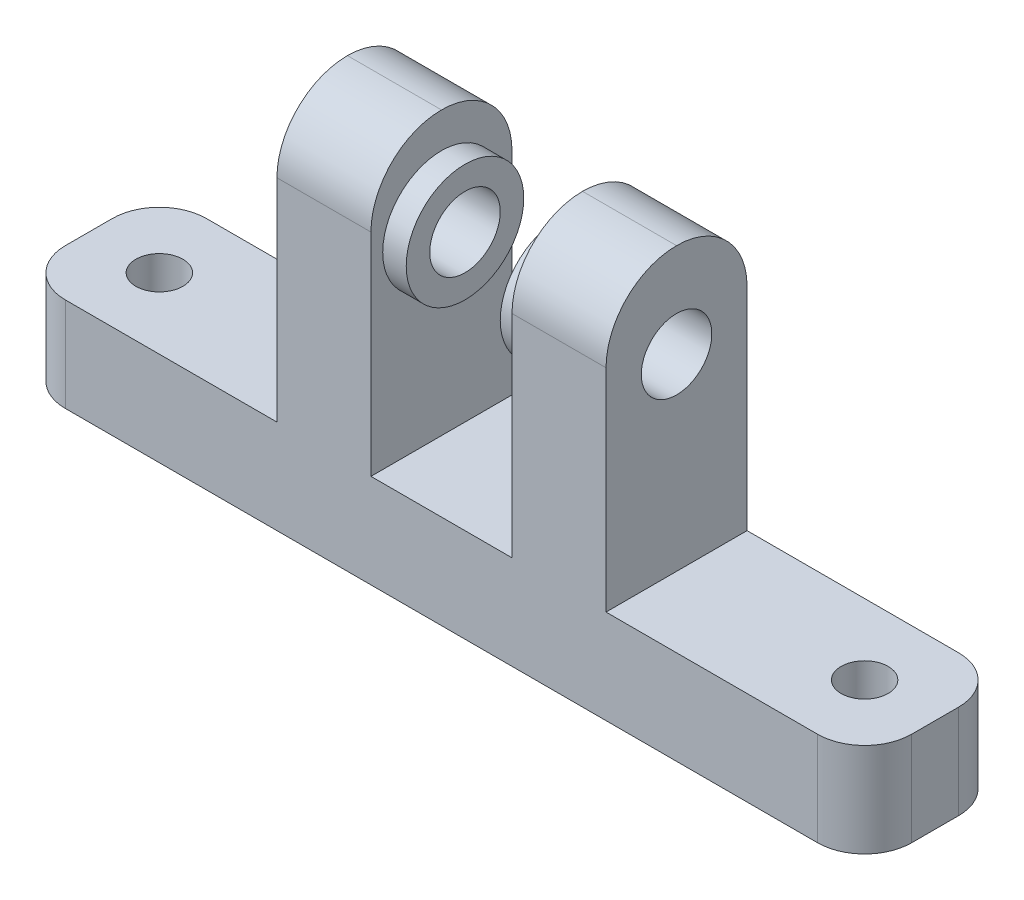
ISO-10303-21;
HEADER;
FILE_DESCRIPTION(('STEP AP214'),'2;1');
FILE_NAME('part.step','',(''),(''),'','','');
FILE_SCHEMA(('AUTOMOTIVE_DESIGN { 1 0 10303 214 1 1 1 1 }'));
ENDSEC;
DATA;
#1=APPLICATION_CONTEXT('core data for automotive mechanical design processes');
#2=APPLICATION_PROTOCOL_DEFINITION('international standard','automotive_design',2000,#1);
#3=PRODUCT_CONTEXT('',#1,'mechanical');
#4=PRODUCT('Part','Part','',(#3));
#5=PRODUCT_RELATED_PRODUCT_CATEGORY('part','',(#4));
#6=PRODUCT_DEFINITION_FORMATION('','',#4);
#7=PRODUCT_DEFINITION_CONTEXT('part definition',#1,'design');
#8=PRODUCT_DEFINITION('design','',#6,#7);
#9=PRODUCT_DEFINITION_SHAPE('','',#8);
#10=(LENGTH_UNIT() NAMED_UNIT(*) SI_UNIT(.MILLI.,.METRE.));
#11=(NAMED_UNIT(*) PLANE_ANGLE_UNIT() SI_UNIT($,.RADIAN.));
#12=(NAMED_UNIT(*) SI_UNIT($,.STERADIAN.) SOLID_ANGLE_UNIT());
#13=UNCERTAINTY_MEASURE_WITH_UNIT(LENGTH_MEASURE(1.E-05),#10,'distance_accuracy_value','');
#14=(GEOMETRIC_REPRESENTATION_CONTEXT(3) GLOBAL_UNCERTAINTY_ASSIGNED_CONTEXT((#13)) GLOBAL_UNIT_ASSIGNED_CONTEXT((#10,
#11,#12)) REPRESENTATION_CONTEXT('',''));
#15=CARTESIAN_POINT('',(0.,0.,0.));
#16=DIRECTION('',(0.,0.,1.));
#17=DIRECTION('',(1.,0.,0.));
#18=AXIS2_PLACEMENT_3D('',#15,#16,#17);
#19=CARTESIAN_POINT('',(-7.,4.,-3.));
#20=DIRECTION('',(1.,0.,0.));
#21=DIRECTION('',(0.,0.,-1.));
#22=AXIS2_PLACEMENT_3D('',#19,#20,#21);
#23=PLANE('',#22);
#24=CARTESIAN_POINT('',(-7.,12.,0.));
#25=DIRECTION('',(1.,0.,0.));
#26=DIRECTION('',(0.,0.,-1.));
#27=AXIS2_PLACEMENT_3D('',#24,#25,#26);
#28=CIRCLE('',#27,1.5);
#29=CARTESIAN_POINT('',(-7.,12.,-1.5));
#30=VERTEX_POINT('',#29);
#31=EDGE_CURVE('E234',#30,#30,#28,.T.);
#32=ORIENTED_EDGE('',*,*,#31,.T.);
#33=EDGE_LOOP('',(#32));
#34=FACE_BOUND('',#33,.T.);
#35=CARTESIAN_POINT('',(-7.,13.,0.));
#36=DIRECTION('',(1.,0.,0.));
#37=DIRECTION('',(0.,0.,-1.));
#38=AXIS2_PLACEMENT_3D('',#35,#36,#37);
#39=CIRCLE('',#38,3.);
#40=CARTESIAN_POINT('',(-7.,13.,3.));
#41=VERTEX_POINT('',#40);
#42=CARTESIAN_POINT('',(-7.,16.,0.));
#43=VERTEX_POINT('',#42);
#44=EDGE_CURVE('E309',#41,#43,#39,.F.);
#45=ORIENTED_EDGE('',*,*,#44,.T.);
#46=CARTESIAN_POINT('',(-7.,13.,0.));
#47=DIRECTION('',(1.,0.,0.));
#48=DIRECTION('',(0.,0.,-1.));
#49=AXIS2_PLACEMENT_3D('',#46,#47,#48);
#50=CIRCLE('',#49,3.);
#51=CARTESIAN_POINT('',(-7.,13.,-3.));
#52=VERTEX_POINT('',#51);
#53=EDGE_CURVE('E166',#43,#52,#50,.F.);
#54=ORIENTED_EDGE('',*,*,#53,.T.);
#55=DIRECTION('',(0.,-1.,0.));
#56=VECTOR('',#55,1.);
#57=CARTESIAN_POINT('',(-7.,4.,-3.));
#58=LINE('',#57,#56);
#59=CARTESIAN_POINT('',(-7.,4.,-3.));
#60=VERTEX_POINT('',#59);
#61=EDGE_CURVE('E160',#52,#60,#58,.T.);
#62=ORIENTED_EDGE('',*,*,#61,.T.);
#63=DIRECTION('',(0.,0.,-1.));
#64=VECTOR('',#63,1.);
#65=CARTESIAN_POINT('',(-7.,4.,3.));
#66=LINE('',#65,#64);
#67=CARTESIAN_POINT('',(-7.,4.,3.));
#68=VERTEX_POINT('',#67);
#69=EDGE_CURVE('E164',#68,#60,#66,.T.);
#70=ORIENTED_EDGE('',*,*,#69,.F.);
#71=DIRECTION('',(0.,-1.,0.));
#72=VECTOR('',#71,1.);
#73=CARTESIAN_POINT('',(-7.,4.,3.));
#74=LINE('',#73,#72);
#75=EDGE_CURVE('E171',#41,#68,#74,.T.);
#76=ORIENTED_EDGE('',*,*,#75,.F.);
#77=EDGE_LOOP('',(#45,#54,#62,#70,#76));
#78=FACE_BOUND('',#77,.T.);
#79=ADVANCED_FACE('F36',(#34,#78),#23,.F.);
#80=CARTESIAN_POINT('',(7.,4.,-3.));
#81=DIRECTION('',(-1.,0.,0.));
#82=DIRECTION('',(0.,0.,1.));
#83=AXIS2_PLACEMENT_3D('',#80,#81,#82);
#84=PLANE('',#83);
#85=CARTESIAN_POINT('',(7.,12.,0.));
#86=DIRECTION('',(-1.,0.,0.));
#87=DIRECTION('',(0.,0.,1.));
#88=AXIS2_PLACEMENT_3D('',#85,#86,#87);
#89=CIRCLE('',#88,1.5);
#90=CARTESIAN_POINT('',(7.,12.,1.5));
#91=VERTEX_POINT('',#90);
#92=EDGE_CURVE('E237',#91,#91,#89,.T.);
#93=ORIENTED_EDGE('',*,*,#92,.T.);
#94=EDGE_LOOP('',(#93));
#95=FACE_BOUND('',#94,.T.);
#96=DIRECTION('',(0.,-1.,0.));
#97=VECTOR('',#96,1.);
#98=CARTESIAN_POINT('',(7.,4.,-3.));
#99=LINE('',#98,#97);
#100=CARTESIAN_POINT('',(7.,13.,-3.));
#101=VERTEX_POINT('',#100);
#102=CARTESIAN_POINT('',(7.,4.,-3.));
#103=VERTEX_POINT('',#102);
#104=EDGE_CURVE('E170',#101,#103,#99,.T.);
#105=ORIENTED_EDGE('',*,*,#104,.F.);
#106=CARTESIAN_POINT('',(7.,13.,0.));
#107=DIRECTION('',(-1.,0.,0.));
#108=DIRECTION('',(0.,0.,1.));
#109=AXIS2_PLACEMENT_3D('',#106,#107,#108);
#110=CIRCLE('',#109,3.);
#111=CARTESIAN_POINT('',(7.,16.,0.));
#112=VERTEX_POINT('',#111);
#113=EDGE_CURVE('E58',#101,#112,#110,.F.);
#114=ORIENTED_EDGE('',*,*,#113,.T.);
#115=CARTESIAN_POINT('',(7.,13.,0.));
#116=DIRECTION('',(-1.,0.,0.));
#117=DIRECTION('',(0.,0.,1.));
#118=AXIS2_PLACEMENT_3D('',#115,#116,#117);
#119=CIRCLE('',#118,3.);
#120=CARTESIAN_POINT('',(7.,13.,3.));
#121=VERTEX_POINT('',#120);
#122=EDGE_CURVE('E53',#112,#121,#119,.F.);
#123=ORIENTED_EDGE('',*,*,#122,.T.);
#124=DIRECTION('',(0.,-1.,0.));
#125=VECTOR('',#124,1.);
#126=CARTESIAN_POINT('',(7.,4.,3.));
#127=LINE('',#126,#125);
#128=CARTESIAN_POINT('',(7.,4.,3.));
#129=VERTEX_POINT('',#128);
#130=EDGE_CURVE('E262',#121,#129,#127,.T.);
#131=ORIENTED_EDGE('',*,*,#130,.T.);
#132=DIRECTION('',(0.,0.,1.));
#133=VECTOR('',#132,1.);
#134=CARTESIAN_POINT('',(7.,4.,-3.));
#135=LINE('',#134,#133);
#136=EDGE_CURVE('E205',#103,#129,#135,.T.);
#137=ORIENTED_EDGE('',*,*,#136,.F.);
#138=EDGE_LOOP('',(#105,#114,#123,#131,#137));
#139=FACE_BOUND('',#138,.T.);
#140=ADVANCED_FACE('F400',(#95,#139),#84,.F.);
#141=CARTESIAN_POINT('',(3.,16.,3.));
#142=DIRECTION('',(1.,0.,0.));
#143=DIRECTION('',(0.,0.,-1.));
#144=AXIS2_PLACEMENT_3D('',#141,#142,#143);
#145=PLANE('',#144);
#146=CARTESIAN_POINT('',(3.,13.,0.));
#147=DIRECTION('',(1.,0.,0.));
#148=DIRECTION('',(0.,0.,-1.));
#149=AXIS2_PLACEMENT_3D('',#146,#147,#148);
#150=CIRCLE('',#149,3.);
#151=CARTESIAN_POINT('',(3.,13.,3.));
#152=VERTEX_POINT('',#151);
#153=CARTESIAN_POINT('',(3.,16.,0.));
#154=VERTEX_POINT('',#153);
#155=EDGE_CURVE('E321',#152,#154,#150,.F.);
#156=ORIENTED_EDGE('',*,*,#155,.T.);
#157=CARTESIAN_POINT('',(3.,13.,0.));
#158=DIRECTION('',(1.,0.,0.));
#159=DIRECTION('',(0.,0.,-1.));
#160=AXIS2_PLACEMENT_3D('',#157,#158,#159);
#161=CIRCLE('',#160,3.);
#162=CARTESIAN_POINT('',(3.,13.,-3.));
#163=VERTEX_POINT('',#162);
#164=EDGE_CURVE('E323',#154,#163,#161,.F.);
#165=ORIENTED_EDGE('',*,*,#164,.T.);
#166=DIRECTION('',(0.,-1.,0.));
#167=VECTOR('',#166,1.);
#168=CARTESIAN_POINT('',(3.,16.,-3.));
#169=LINE('',#168,#167);
#170=CARTESIAN_POINT('',(3.,4.,-3.));
#171=VERTEX_POINT('',#170);
#172=EDGE_CURVE('E240',#163,#171,#169,.T.);
#173=ORIENTED_EDGE('',*,*,#172,.T.);
#174=DIRECTION('',(0.,0.,1.));
#175=VECTOR('',#174,1.);
#176=CARTESIAN_POINT('',(3.,4.,3.));
#177=LINE('',#176,#175);
#178=CARTESIAN_POINT('',(3.,4.,3.));
#179=VERTEX_POINT('',#178);
#180=EDGE_CURVE('E244',#171,#179,#177,.T.);
#181=ORIENTED_EDGE('',*,*,#180,.T.);
#182=DIRECTION('',(0.,-1.,0.));
#183=VECTOR('',#182,1.);
#184=CARTESIAN_POINT('',(3.,16.,3.));
#185=LINE('',#184,#183);
#186=EDGE_CURVE('E242',#152,#179,#185,.T.);
#187=ORIENTED_EDGE('',*,*,#186,.F.);
#188=EDGE_LOOP('',(#156,#165,#173,#181,#187));
#189=FACE_BOUND('',#188,.T.);
#190=CARTESIAN_POINT('',(3.,12.,0.));
#191=DIRECTION('',(1.,0.,0.));
#192=DIRECTION('',(0.,0.,-1.));
#193=AXIS2_PLACEMENT_3D('',#190,#191,#192);
#194=CIRCLE('',#193,2.5);
#195=CARTESIAN_POINT('',(3.,12.,-2.5));
#196=VERTEX_POINT('',#195);
#197=EDGE_CURVE('E272',#196,#196,#194,.F.);
#198=ORIENTED_EDGE('',*,*,#197,.F.);
#199=EDGE_LOOP('',(#198));
#200=FACE_BOUND('',#199,.T.);
#201=ADVANCED_FACE('F345',(#189,#200),#145,.F.);
#202=CARTESIAN_POINT('',(-3.,16.,3.));
#203=DIRECTION('',(-1.,0.,0.));
#204=DIRECTION('',(0.,0.,1.));
#205=AXIS2_PLACEMENT_3D('',#202,#203,#204);
#206=PLANE('',#205);
#207=DIRECTION('',(0.,-1.,0.));
#208=VECTOR('',#207,1.);
#209=CARTESIAN_POINT('',(-3.,16.,-3.));
#210=LINE('',#209,#208);
#211=CARTESIAN_POINT('',(-3.,13.,-3.));
#212=VERTEX_POINT('',#211);
#213=CARTESIAN_POINT('',(-3.,4.,-3.));
#214=VERTEX_POINT('',#213);
#215=EDGE_CURVE('E250',#212,#214,#210,.T.);
#216=ORIENTED_EDGE('',*,*,#215,.F.);
#217=CARTESIAN_POINT('',(-3.,13.,0.));
#218=DIRECTION('',(-1.,0.,0.));
#219=DIRECTION('',(0.,0.,1.));
#220=AXIS2_PLACEMENT_3D('',#217,#218,#219);
#221=CIRCLE('',#220,3.);
#222=CARTESIAN_POINT('',(-3.,16.,0.));
#223=VERTEX_POINT('',#222);
#224=EDGE_CURVE('E319',#212,#223,#221,.F.);
#225=ORIENTED_EDGE('',*,*,#224,.T.);
#226=CARTESIAN_POINT('',(-3.,13.,0.));
#227=DIRECTION('',(-1.,0.,0.));
#228=DIRECTION('',(0.,0.,1.));
#229=AXIS2_PLACEMENT_3D('',#226,#227,#228);
#230=CIRCLE('',#229,3.);
#231=CARTESIAN_POINT('',(-3.,13.,3.));
#232=VERTEX_POINT('',#231);
#233=EDGE_CURVE('E317',#223,#232,#230,.F.);
#234=ORIENTED_EDGE('',*,*,#233,.T.);
#235=DIRECTION('',(0.,-1.,0.));
#236=VECTOR('',#235,1.);
#237=CARTESIAN_POINT('',(-3.,16.,3.));
#238=LINE('',#237,#236);
#239=CARTESIAN_POINT('',(-3.,4.,3.));
#240=VERTEX_POINT('',#239);
#241=EDGE_CURVE('E252',#232,#240,#238,.T.);
#242=ORIENTED_EDGE('',*,*,#241,.T.);
#243=DIRECTION('',(0.,0.,-1.));
#244=VECTOR('',#243,1.);
#245=CARTESIAN_POINT('',(-3.,4.,3.));
#246=LINE('',#245,#244);
#247=EDGE_CURVE('E247',#240,#214,#246,.T.);
#248=ORIENTED_EDGE('',*,*,#247,.T.);
#249=EDGE_LOOP('',(#216,#225,#234,#242,#248));
#250=FACE_BOUND('',#249,.T.);
#251=CARTESIAN_POINT('',(-3.,12.,0.));
#252=DIRECTION('',(-1.,0.,0.));
#253=DIRECTION('',(0.,0.,1.));
#254=AXIS2_PLACEMENT_3D('',#251,#252,#253);
#255=CIRCLE('',#254,2.5);
#256=CARTESIAN_POINT('',(-3.,12.,2.5));
#257=VERTEX_POINT('',#256);
#258=EDGE_CURVE('E269',#257,#257,#255,.F.);
#259=ORIENTED_EDGE('',*,*,#258,.F.);
#260=EDGE_LOOP('',(#259));
#261=FACE_BOUND('',#260,.T.);
#262=ADVANCED_FACE('F355',(#250,#261),#206,.F.);
#263=CARTESIAN_POINT('',(0.,4.,0.));
#264=DIRECTION('',(0.,1.,0.));
#265=DIRECTION('',(0.,0.,1.));
#266=AXIS2_PLACEMENT_3D('',#263,#264,#265);
#267=PLANE('',#266);
#268=DIRECTION('',(1.,0.,0.));
#269=VECTOR('',#268,1.);
#270=CARTESIAN_POINT('',(-7.,4.,3.));
#271=LINE('',#270,#269);
#272=EDGE_CURVE('E258',#240,#179,#271,.T.);
#273=ORIENTED_EDGE('',*,*,#272,.T.);
#274=ORIENTED_EDGE('',*,*,#180,.F.);
#275=DIRECTION('',(-1.,0.,0.));
#276=VECTOR('',#275,1.);
#277=CARTESIAN_POINT('',(-7.,4.,-3.));
#278=LINE('',#277,#276);
#279=EDGE_CURVE('E255',#171,#214,#278,.T.);
#280=ORIENTED_EDGE('',*,*,#279,.T.);
#281=ORIENTED_EDGE('',*,*,#247,.F.);
#282=EDGE_LOOP('',(#273,#274,#280,#281));
#283=FACE_BOUND('',#282,.T.);
#284=ADVANCED_FACE('F351',(#283),#267,.T.);
#285=CARTESIAN_POINT('',(-7.,4.,-3.));
#286=DIRECTION('',(0.,0.,1.));
#287=DIRECTION('',(1.,0.,0.));
#288=AXIS2_PLACEMENT_3D('',#285,#286,#287);
#289=PLANE('',#288);
#290=ORIENTED_EDGE('',*,*,#61,.F.);
#291=DIRECTION('',(-1.,0.,0.));
#292=VECTOR('',#291,1.);
#293=CARTESIAN_POINT('',(-3.,13.,-3.));
#294=LINE('',#293,#292);
#295=EDGE_CURVE('E315',#52,#212,#294,.F.);
#296=ORIENTED_EDGE('',*,*,#295,.T.);
#297=ORIENTED_EDGE('',*,*,#215,.T.);
#298=ORIENTED_EDGE('',*,*,#279,.F.);
#299=ORIENTED_EDGE('',*,*,#172,.F.);
#300=DIRECTION('',(-1.,0.,0.));
#301=VECTOR('',#300,1.);
#302=CARTESIAN_POINT('',(-7.,13.,-3.));
#303=LINE('',#302,#301);
#304=EDGE_CURVE('E312',#163,#101,#303,.F.);
#305=ORIENTED_EDGE('',*,*,#304,.T.);
#306=ORIENTED_EDGE('',*,*,#104,.T.);
#307=DIRECTION('',(-1.,0.,0.));
#308=VECTOR('',#307,1.);
#309=CARTESIAN_POINT('',(18.,4.,-3.));
#310=LINE('',#309,#308);
#311=CARTESIAN_POINT('',(16.,4.,-3.));
#312=VERTEX_POINT('',#311);
#313=EDGE_CURVE('E212',#312,#103,#310,.T.);
#314=ORIENTED_EDGE('',*,*,#313,.F.);
#315=DIRECTION('',(0.,1.,0.));
#316=VECTOR('',#315,1.);
#317=CARTESIAN_POINT('',(16.,0.,-3.));
#318=LINE('',#317,#316);
#319=CARTESIAN_POINT('',(16.,0.,-3.));
#320=VERTEX_POINT('',#319);
#321=EDGE_CURVE('E285',#312,#320,#318,.F.);
#322=ORIENTED_EDGE('',*,*,#321,.T.);
#323=DIRECTION('',(-1.,0.,0.));
#324=VECTOR('',#323,1.);
#325=CARTESIAN_POINT('',(-7.,0.,-3.));
#326=LINE('',#325,#324);
#327=CARTESIAN_POINT('',(-16.,0.,-3.));
#328=VERTEX_POINT('',#327);
#329=EDGE_CURVE('E254',#320,#328,#326,.T.);
#330=ORIENTED_EDGE('',*,*,#329,.T.);
#331=DIRECTION('',(0.,1.,0.));
#332=VECTOR('',#331,1.);
#333=CARTESIAN_POINT('',(-16.,4.,-3.));
#334=LINE('',#333,#332);
#335=CARTESIAN_POINT('',(-16.,4.,-3.));
#336=VERTEX_POINT('',#335);
#337=EDGE_CURVE('E179',#328,#336,#334,.T.);
#338=ORIENTED_EDGE('',*,*,#337,.T.);
#339=DIRECTION('',(-1.,0.,0.));
#340=VECTOR('',#339,1.);
#341=CARTESIAN_POINT('',(-7.,4.,-3.));
#342=LINE('',#341,#340);
#343=EDGE_CURVE('E175',#60,#336,#342,.T.);
#344=ORIENTED_EDGE('',*,*,#343,.F.);
#345=EDGE_LOOP('',(#290,#296,#297,#298,#299,#305,#306,#314,#322,#330,#338,#344));
#346=FACE_BOUND('',#345,.T.);
#347=ADVANCED_FACE('F176',(#346),#289,.F.);
#348=CARTESIAN_POINT('',(-7.,4.,3.));
#349=DIRECTION('',(0.,0.,-1.));
#350=DIRECTION('',(-1.,0.,0.));
#351=AXIS2_PLACEMENT_3D('',#348,#349,#350);
#352=PLANE('',#351);
#353=ORIENTED_EDGE('',*,*,#130,.F.);
#354=DIRECTION('',(1.,0.,0.));
#355=VECTOR('',#354,1.);
#356=CARTESIAN_POINT('',(-7.,13.,3.));
#357=LINE('',#356,#355);
#358=EDGE_CURVE('E11',#121,#152,#357,.F.);
#359=ORIENTED_EDGE('',*,*,#358,.T.);
#360=ORIENTED_EDGE('',*,*,#186,.T.);
#361=ORIENTED_EDGE('',*,*,#272,.F.);
#362=ORIENTED_EDGE('',*,*,#241,.F.);
#363=DIRECTION('',(1.,0.,0.));
#364=VECTOR('',#363,1.);
#365=CARTESIAN_POINT('',(-7.,13.,3.));
#366=LINE('',#365,#364);
#367=EDGE_CURVE('E45',#232,#41,#366,.F.);
#368=ORIENTED_EDGE('',*,*,#367,.T.);
#369=ORIENTED_EDGE('',*,*,#75,.T.);
#370=DIRECTION('',(1.,0.,0.));
#371=VECTOR('',#370,1.);
#372=CARTESIAN_POINT('',(-18.,4.,3.));
#373=LINE('',#372,#371);
#374=CARTESIAN_POINT('',(-16.,4.,3.));
#375=VERTEX_POINT('',#374);
#376=EDGE_CURVE('E186',#375,#68,#373,.T.);
#377=ORIENTED_EDGE('',*,*,#376,.F.);
#378=DIRECTION('',(0.,1.,0.));
#379=VECTOR('',#378,1.);
#380=CARTESIAN_POINT('',(-16.,0.,3.));
#381=LINE('',#380,#379);
#382=CARTESIAN_POINT('',(-16.,0.,3.));
#383=VERTEX_POINT('',#382);
#384=EDGE_CURVE('E307',#375,#383,#381,.F.);
#385=ORIENTED_EDGE('',*,*,#384,.T.);
#386=DIRECTION('',(1.,0.,0.));
#387=VECTOR('',#386,1.);
#388=CARTESIAN_POINT('',(-7.,0.,3.));
#389=LINE('',#388,#387);
#390=CARTESIAN_POINT('',(16.,0.,3.));
#391=VERTEX_POINT('',#390);
#392=EDGE_CURVE('E259',#383,#391,#389,.T.);
#393=ORIENTED_EDGE('',*,*,#392,.T.);
#394=DIRECTION('',(0.,1.,0.));
#395=VECTOR('',#394,1.);
#396=CARTESIAN_POINT('',(16.,4.,3.));
#397=LINE('',#396,#395);
#398=CARTESIAN_POINT('',(16.,4.,3.));
#399=VERTEX_POINT('',#398);
#400=EDGE_CURVE('E304',#391,#399,#397,.T.);
#401=ORIENTED_EDGE('',*,*,#400,.T.);
#402=DIRECTION('',(1.,0.,0.));
#403=VECTOR('',#402,1.);
#404=CARTESIAN_POINT('',(18.,4.,3.));
#405=LINE('',#404,#403);
#406=EDGE_CURVE('E215',#129,#399,#405,.T.);
#407=ORIENTED_EDGE('',*,*,#406,.F.);
#408=EDGE_LOOP('',(#353,#359,#360,#361,#362,#368,#369,#377,#385,#393,#401,#407));
#409=FACE_BOUND('',#408,.T.);
#410=ADVANCED_FACE('F341',(#409),#352,.F.);
#411=CARTESIAN_POINT('',(0.,0.,0.));
#412=DIRECTION('',(0.,1.,0.));
#413=DIRECTION('',(0.,0.,1.));
#414=AXIS2_PLACEMENT_3D('',#411,#412,#413);
#415=PLANE('',#414);
#416=ORIENTED_EDGE('',*,*,#329,.F.);
#417=CARTESIAN_POINT('',(16.,0.,-1.));
#418=DIRECTION('',(0.,1.,0.));
#419=DIRECTION('',(0.,0.,1.));
#420=AXIS2_PLACEMENT_3D('',#417,#418,#419);
#421=CIRCLE('',#420,2.);
#422=CARTESIAN_POINT('',(18.,0.,-1.));
#423=VERTEX_POINT('',#422);
#424=EDGE_CURVE('E293',#320,#423,#421,.F.);
#425=ORIENTED_EDGE('',*,*,#424,.T.);
#426=DIRECTION('',(0.,0.,-1.));
#427=VECTOR('',#426,1.);
#428=CARTESIAN_POINT('',(18.,0.,-3.));
#429=LINE('',#428,#427);
#430=CARTESIAN_POINT('',(18.,0.,1.));
#431=VERTEX_POINT('',#430);
#432=EDGE_CURVE('E208',#431,#423,#429,.T.);
#433=ORIENTED_EDGE('',*,*,#432,.F.);
#434=CARTESIAN_POINT('',(16.,0.,1.));
#435=DIRECTION('',(0.,1.,0.));
#436=DIRECTION('',(0.,0.,1.));
#437=AXIS2_PLACEMENT_3D('',#434,#435,#436);
#438=CIRCLE('',#437,2.);
#439=EDGE_CURVE('E287',#431,#391,#438,.F.);
#440=ORIENTED_EDGE('',*,*,#439,.T.);
#441=ORIENTED_EDGE('',*,*,#392,.F.);
#442=CARTESIAN_POINT('',(-16.,0.,1.));
#443=DIRECTION('',(0.,1.,0.));
#444=DIRECTION('',(0.,0.,1.));
#445=AXIS2_PLACEMENT_3D('',#442,#443,#444);
#446=CIRCLE('',#445,2.);
#447=CARTESIAN_POINT('',(-18.,0.,1.));
#448=VERTEX_POINT('',#447);
#449=EDGE_CURVE('E289',#383,#448,#446,.F.);
#450=ORIENTED_EDGE('',*,*,#449,.T.);
#451=DIRECTION('',(0.,0.,1.));
#452=VECTOR('',#451,1.);
#453=CARTESIAN_POINT('',(-18.,0.,-3.));
#454=LINE('',#453,#452);
#455=CARTESIAN_POINT('',(-18.,0.,-1.));
#456=VERTEX_POINT('',#455);
#457=EDGE_CURVE('E192',#456,#448,#454,.T.);
#458=ORIENTED_EDGE('',*,*,#457,.F.);
#459=CARTESIAN_POINT('',(-16.,0.,-1.));
#460=DIRECTION('',(0.,1.,0.));
#461=DIRECTION('',(0.,0.,1.));
#462=AXIS2_PLACEMENT_3D('',#459,#460,#461);
#463=CIRCLE('',#462,2.);
#464=EDGE_CURVE('E291',#456,#328,#463,.F.);
#465=ORIENTED_EDGE('',*,*,#464,.T.);
#466=EDGE_LOOP('',(#416,#425,#433,#440,#441,#450,#458,#465));
#467=FACE_BOUND('',#466,.T.);
#468=CARTESIAN_POINT('',(15.,0.,0.));
#469=DIRECTION('',(0.,1.,0.));
#470=DIRECTION('',(0.,0.,1.));
#471=AXIS2_PLACEMENT_3D('',#468,#469,#470);
#472=CIRCLE('',#471,1.);
#473=CARTESIAN_POINT('',(15.,0.,1.));
#474=VERTEX_POINT('',#473);
#475=EDGE_CURVE('E202',#474,#474,#472,.T.);
#476=ORIENTED_EDGE('',*,*,#475,.T.);
#477=EDGE_LOOP('',(#476));
#478=FACE_BOUND('',#477,.T.);
#479=CARTESIAN_POINT('',(-15.,0.,0.));
#480=DIRECTION('',(0.,1.,0.));
#481=DIRECTION('',(0.,0.,1.));
#482=AXIS2_PLACEMENT_3D('',#479,#480,#481);
#483=CIRCLE('',#482,1.);
#484=CARTESIAN_POINT('',(-15.,0.,1.));
#485=VERTEX_POINT('',#484);
#486=EDGE_CURVE('E188',#485,#485,#483,.T.);
#487=ORIENTED_EDGE('',*,*,#486,.T.);
#488=EDGE_LOOP('',(#487));
#489=FACE_BOUND('',#488,.T.);
#490=ADVANCED_FACE('F372',(#467,#478,#489),#415,.F.);
#491=CARTESIAN_POINT('',(-7.,12.,0.));
#492=DIRECTION('',(1.,0.,0.));
#493=DIRECTION('',(0.,0.,-1.));
#494=AXIS2_PLACEMENT_3D('',#491,#492,#493);
#495=CYLINDRICAL_SURFACE('',#494,1.5);
#496=ORIENTED_EDGE('',*,*,#92,.F.);
#497=EDGE_LOOP('',(#496));
#498=FACE_BOUND('',#497,.T.);
#499=CARTESIAN_POINT('',(2.,12.,0.));
#500=DIRECTION('',(-1.,0.,0.));
#501=DIRECTION('',(0.,0.,1.));
#502=AXIS2_PLACEMENT_3D('',#499,#500,#501);
#503=CIRCLE('',#502,1.5);
#504=CARTESIAN_POINT('',(2.,12.,1.5));
#505=VERTEX_POINT('',#504);
#506=EDGE_CURVE('E211',#505,#505,#503,.T.);
#507=ORIENTED_EDGE('',*,*,#506,.T.);
#508=EDGE_LOOP('',(#507));
#509=FACE_BOUND('',#508,.T.);
#510=ADVANCED_FACE('F540',(#498,#509),#495,.F.);
#511=ORIENTED_EDGE('',*,*,#31,.F.);
#512=EDGE_LOOP('',(#511));
#513=FACE_BOUND('',#512,.T.);
#514=CARTESIAN_POINT('',(-2.,12.,0.));
#515=DIRECTION('',(1.,0.,0.));
#516=DIRECTION('',(0.,0.,-1.));
#517=AXIS2_PLACEMENT_3D('',#514,#515,#516);
#518=CIRCLE('',#517,1.5);
#519=CARTESIAN_POINT('',(-2.,12.,-1.5));
#520=VERTEX_POINT('',#519);
#521=EDGE_CURVE('E228',#520,#520,#518,.T.);
#522=ORIENTED_EDGE('',*,*,#521,.T.);
#523=EDGE_LOOP('',(#522));
#524=FACE_BOUND('',#523,.T.);
#525=ADVANCED_FACE('F532',(#513,#524),#495,.F.);
#526=CARTESIAN_POINT('',(-2.,12.,0.));
#527=DIRECTION('',(1.,0.,0.));
#528=DIRECTION('',(0.,0.,-1.));
#529=AXIS2_PLACEMENT_3D('',#526,#527,#528);
#530=PLANE('',#529);
#531=CARTESIAN_POINT('',(-2.,12.,0.));
#532=DIRECTION('',(1.,0.,0.));
#533=DIRECTION('',(0.,0.,-1.));
#534=AXIS2_PLACEMENT_3D('',#531,#532,#533);
#535=CIRCLE('',#534,2.5);
#536=CARTESIAN_POINT('',(-2.,12.,-2.5));
#537=VERTEX_POINT('',#536);
#538=EDGE_CURVE('E231',#537,#537,#535,.T.);
#539=ORIENTED_EDGE('',*,*,#538,.T.);
#540=EDGE_LOOP('',(#539));
#541=FACE_BOUND('',#540,.T.);
#542=ORIENTED_EDGE('',*,*,#521,.F.);
#543=EDGE_LOOP('',(#542));
#544=FACE_BOUND('',#543,.T.);
#545=ADVANCED_FACE('F524',(#541,#544),#530,.T.);
#546=CARTESIAN_POINT('',(-2.,12.,0.));
#547=DIRECTION('',(-1.,0.,0.));
#548=DIRECTION('',(0.,0.,1.));
#549=AXIS2_PLACEMENT_3D('',#546,#547,#548);
#550=CYLINDRICAL_SURFACE('',#549,2.5);
#551=ORIENTED_EDGE('',*,*,#538,.F.);
#552=EDGE_LOOP('',(#551));
#553=FACE_BOUND('',#552,.T.);
#554=ORIENTED_EDGE('',*,*,#258,.T.);
#555=EDGE_LOOP('',(#554));
#556=FACE_BOUND('',#555,.T.);
#557=ADVANCED_FACE('F515',(#553,#556),#550,.T.);
#558=CARTESIAN_POINT('',(2.,12.,0.));
#559=DIRECTION('',(-1.,0.,0.));
#560=DIRECTION('',(0.,0.,1.));
#561=AXIS2_PLACEMENT_3D('',#558,#559,#560);
#562=PLANE('',#561);
#563=CARTESIAN_POINT('',(2.,12.,0.));
#564=DIRECTION('',(-1.,0.,0.));
#565=DIRECTION('',(0.,0.,1.));
#566=AXIS2_PLACEMENT_3D('',#563,#564,#565);
#567=CIRCLE('',#566,2.5);
#568=CARTESIAN_POINT('',(2.,12.,2.5));
#569=VERTEX_POINT('',#568);
#570=EDGE_CURVE('E225',#569,#569,#567,.T.);
#571=ORIENTED_EDGE('',*,*,#570,.T.);
#572=EDGE_LOOP('',(#571));
#573=FACE_BOUND('',#572,.T.);
#574=ORIENTED_EDGE('',*,*,#506,.F.);
#575=EDGE_LOOP('',(#574));
#576=FACE_BOUND('',#575,.T.);
#577=ADVANCED_FACE('F507',(#573,#576),#562,.T.);
#578=CARTESIAN_POINT('',(2.,12.,0.));
#579=DIRECTION('',(1.,0.,0.));
#580=DIRECTION('',(0.,0.,-1.));
#581=AXIS2_PLACEMENT_3D('',#578,#579,#580);
#582=CYLINDRICAL_SURFACE('',#581,2.5);
#583=ORIENTED_EDGE('',*,*,#570,.F.);
#584=EDGE_LOOP('',(#583));
#585=FACE_BOUND('',#584,.T.);
#586=ORIENTED_EDGE('',*,*,#197,.T.);
#587=EDGE_LOOP('',(#586));
#588=FACE_BOUND('',#587,.T.);
#589=ADVANCED_FACE('F501',(#585,#588),#582,.T.);
#590=CARTESIAN_POINT('',(18.,0.,-3.));
#591=DIRECTION('',(1.,0.,0.));
#592=DIRECTION('',(0.,0.,-1.));
#593=AXIS2_PLACEMENT_3D('',#590,#591,#592);
#594=PLANE('',#593);
#595=ORIENTED_EDGE('',*,*,#432,.T.);
#596=DIRECTION('',(0.,1.,0.));
#597=VECTOR('',#596,1.);
#598=CARTESIAN_POINT('',(18.,4.,-1.));
#599=LINE('',#598,#597);
#600=CARTESIAN_POINT('',(18.,4.,-1.));
#601=VERTEX_POINT('',#600);
#602=EDGE_CURVE('E277',#423,#601,#599,.T.);
#603=ORIENTED_EDGE('',*,*,#602,.T.);
#604=DIRECTION('',(0.,0.,-1.));
#605=VECTOR('',#604,1.);
#606=CARTESIAN_POINT('',(18.,4.,-3.));
#607=LINE('',#606,#605);
#608=CARTESIAN_POINT('',(18.,4.,1.));
#609=VERTEX_POINT('',#608);
#610=EDGE_CURVE('E218',#609,#601,#607,.T.);
#611=ORIENTED_EDGE('',*,*,#610,.F.);
#612=DIRECTION('',(0.,1.,0.));
#613=VECTOR('',#612,1.);
#614=CARTESIAN_POINT('',(18.,0.,1.));
#615=LINE('',#614,#613);
#616=EDGE_CURVE('E275',#609,#431,#615,.F.);
#617=ORIENTED_EDGE('',*,*,#616,.T.);
#618=EDGE_LOOP('',(#595,#603,#611,#617));
#619=FACE_BOUND('',#618,.T.);
#620=ADVANCED_FACE('F391',(#619),#594,.T.);
#621=CARTESIAN_POINT('',(0.,4.,0.));
#622=DIRECTION('',(0.,-1.,0.));
#623=DIRECTION('',(0.,0.,-1.));
#624=AXIS2_PLACEMENT_3D('',#621,#622,#623);
#625=PLANE('',#624);
#626=CARTESIAN_POINT('',(15.,4.,0.));
#627=DIRECTION('',(0.,1.,0.));
#628=DIRECTION('',(0.,0.,1.));
#629=AXIS2_PLACEMENT_3D('',#626,#627,#628);
#630=CIRCLE('',#629,1.);
#631=CARTESIAN_POINT('',(15.,4.,1.));
#632=VERTEX_POINT('',#631);
#633=EDGE_CURVE('E199',#632,#632,#630,.T.);
#634=ORIENTED_EDGE('',*,*,#633,.F.);
#635=EDGE_LOOP('',(#634));
#636=FACE_BOUND('',#635,.T.);
#637=ORIENTED_EDGE('',*,*,#610,.T.);
#638=CARTESIAN_POINT('',(16.,4.,-1.));
#639=DIRECTION('',(0.,-1.,0.));
#640=DIRECTION('',(0.,0.,-1.));
#641=AXIS2_PLACEMENT_3D('',#638,#639,#640);
#642=CIRCLE('',#641,2.);
#643=EDGE_CURVE('E282',#601,#312,#642,.F.);
#644=ORIENTED_EDGE('',*,*,#643,.T.);
#645=ORIENTED_EDGE('',*,*,#313,.T.);
#646=ORIENTED_EDGE('',*,*,#136,.T.);
#647=ORIENTED_EDGE('',*,*,#406,.T.);
#648=CARTESIAN_POINT('',(16.,4.,1.));
#649=DIRECTION('',(0.,-1.,0.));
#650=DIRECTION('',(0.,0.,-1.));
#651=AXIS2_PLACEMENT_3D('',#648,#649,#650);
#652=CIRCLE('',#651,2.);
#653=EDGE_CURVE('E280',#399,#609,#652,.F.);
#654=ORIENTED_EDGE('',*,*,#653,.T.);
#655=EDGE_LOOP('',(#637,#644,#645,#646,#647,#654));
#656=FACE_BOUND('',#655,.T.);
#657=ADVANCED_FACE('F398',(#636,#656),#625,.F.);
#658=CARTESIAN_POINT('',(15.,0.,0.));
#659=DIRECTION('',(0.,1.,0.));
#660=DIRECTION('',(0.,0.,1.));
#661=AXIS2_PLACEMENT_3D('',#658,#659,#660);
#662=CYLINDRICAL_SURFACE('',#661,1.);
#663=ORIENTED_EDGE('',*,*,#475,.F.);
#664=EDGE_LOOP('',(#663));
#665=FACE_BOUND('',#664,.T.);
#666=ORIENTED_EDGE('',*,*,#633,.T.);
#667=EDGE_LOOP('',(#666));
#668=FACE_BOUND('',#667,.T.);
#669=ADVANCED_FACE('F480',(#665,#668),#662,.F.);
#670=CARTESIAN_POINT('',(-18.,0.,-3.));
#671=DIRECTION('',(-1.,0.,0.));
#672=DIRECTION('',(0.,0.,1.));
#673=AXIS2_PLACEMENT_3D('',#670,#671,#672);
#674=PLANE('',#673);
#675=DIRECTION('',(0.,0.,1.));
#676=VECTOR('',#675,1.);
#677=CARTESIAN_POINT('',(-18.,4.,-3.));
#678=LINE('',#677,#676);
#679=CARTESIAN_POINT('',(-18.,4.,-1.));
#680=VERTEX_POINT('',#679);
#681=CARTESIAN_POINT('',(-18.,4.,1.));
#682=VERTEX_POINT('',#681);
#683=EDGE_CURVE('E181',#680,#682,#678,.T.);
#684=ORIENTED_EDGE('',*,*,#683,.F.);
#685=DIRECTION('',(0.,1.,0.));
#686=VECTOR('',#685,1.);
#687=CARTESIAN_POINT('',(-18.,0.,-1.));
#688=LINE('',#687,#686);
#689=EDGE_CURVE('E302',#680,#456,#688,.F.);
#690=ORIENTED_EDGE('',*,*,#689,.T.);
#691=ORIENTED_EDGE('',*,*,#457,.T.);
#692=DIRECTION('',(0.,1.,0.));
#693=VECTOR('',#692,1.);
#694=CARTESIAN_POINT('',(-18.,4.,1.));
#695=LINE('',#694,#693);
#696=EDGE_CURVE('E299',#448,#682,#695,.T.);
#697=ORIENTED_EDGE('',*,*,#696,.T.);
#698=EDGE_LOOP('',(#684,#690,#691,#697));
#699=FACE_BOUND('',#698,.T.);
#700=ADVANCED_FACE('F377',(#699),#674,.T.);
#701=CARTESIAN_POINT('',(0.,4.,0.));
#702=DIRECTION('',(0.,1.,0.));
#703=DIRECTION('',(0.,0.,1.));
#704=AXIS2_PLACEMENT_3D('',#701,#702,#703);
#705=PLANE('',#704);
#706=CARTESIAN_POINT('',(-15.,4.,0.));
#707=DIRECTION('',(0.,1.,0.));
#708=DIRECTION('',(0.,0.,1.));
#709=AXIS2_PLACEMENT_3D('',#706,#707,#708);
#710=CIRCLE('',#709,1.);
#711=CARTESIAN_POINT('',(-15.,4.,1.));
#712=VERTEX_POINT('',#711);
#713=EDGE_CURVE('E196',#712,#712,#710,.T.);
#714=ORIENTED_EDGE('',*,*,#713,.F.);
#715=EDGE_LOOP('',(#714));
#716=FACE_BOUND('',#715,.T.);
#717=ORIENTED_EDGE('',*,*,#343,.T.);
#718=CARTESIAN_POINT('',(-16.,4.,-1.));
#719=DIRECTION('',(0.,1.,0.));
#720=DIRECTION('',(0.,0.,1.));
#721=AXIS2_PLACEMENT_3D('',#718,#719,#720);
#722=CIRCLE('',#721,2.);
#723=EDGE_CURVE('E297',#336,#680,#722,.T.);
#724=ORIENTED_EDGE('',*,*,#723,.T.);
#725=ORIENTED_EDGE('',*,*,#683,.T.);
#726=CARTESIAN_POINT('',(-16.,4.,1.));
#727=DIRECTION('',(0.,1.,0.));
#728=DIRECTION('',(0.,0.,1.));
#729=AXIS2_PLACEMENT_3D('',#726,#727,#728);
#730=CIRCLE('',#729,2.);
#731=EDGE_CURVE('E295',#682,#375,#730,.T.);
#732=ORIENTED_EDGE('',*,*,#731,.T.);
#733=ORIENTED_EDGE('',*,*,#376,.T.);
#734=ORIENTED_EDGE('',*,*,#69,.T.);
#735=EDGE_LOOP('',(#717,#724,#725,#732,#733,#734));
#736=FACE_BOUND('',#735,.T.);
#737=ADVANCED_FACE('F184',(#716,#736),#705,.T.);
#738=CARTESIAN_POINT('',(-15.,0.,0.));
#739=DIRECTION('',(0.,1.,0.));
#740=DIRECTION('',(0.,0.,1.));
#741=AXIS2_PLACEMENT_3D('',#738,#739,#740);
#742=CYLINDRICAL_SURFACE('',#741,1.);
#743=ORIENTED_EDGE('',*,*,#486,.F.);
#744=EDGE_LOOP('',(#743));
#745=FACE_BOUND('',#744,.T.);
#746=ORIENTED_EDGE('',*,*,#713,.T.);
#747=EDGE_LOOP('',(#746));
#748=FACE_BOUND('',#747,.T.);
#749=ADVANCED_FACE('F415',(#745,#748),#742,.F.);
#750=CARTESIAN_POINT('',(16.,0.,-1.));
#751=DIRECTION('',(0.,-1.,0.));
#752=DIRECTION('',(0.,0.,-1.));
#753=AXIS2_PLACEMENT_3D('',#750,#751,#752);
#754=CYLINDRICAL_SURFACE('',#753,2.);
#755=ORIENTED_EDGE('',*,*,#424,.F.);
#756=ORIENTED_EDGE('',*,*,#321,.F.);
#757=ORIENTED_EDGE('',*,*,#643,.F.);
#758=ORIENTED_EDGE('',*,*,#602,.F.);
#759=EDGE_LOOP('',(#755,#756,#757,#758));
#760=FACE_BOUND('',#759,.T.);
#761=ADVANCED_FACE('F386',(#760),#754,.T.);
#762=CARTESIAN_POINT('',(-16.,4.,-1.));
#763=DIRECTION('',(0.,-1.,0.));
#764=DIRECTION('',(0.,0.,-1.));
#765=AXIS2_PLACEMENT_3D('',#762,#763,#764);
#766=CYLINDRICAL_SURFACE('',#765,2.);
#767=ORIENTED_EDGE('',*,*,#464,.F.);
#768=ORIENTED_EDGE('',*,*,#689,.F.);
#769=ORIENTED_EDGE('',*,*,#723,.F.);
#770=ORIENTED_EDGE('',*,*,#337,.F.);
#771=EDGE_LOOP('',(#767,#768,#769,#770));
#772=FACE_BOUND('',#771,.T.);
#773=ADVANCED_FACE('F381',(#772),#766,.T.);
#774=CARTESIAN_POINT('',(-16.,0.,1.));
#775=DIRECTION('',(0.,-1.,0.));
#776=DIRECTION('',(0.,0.,-1.));
#777=AXIS2_PLACEMENT_3D('',#774,#775,#776);
#778=CYLINDRICAL_SURFACE('',#777,2.);
#779=ORIENTED_EDGE('',*,*,#449,.F.);
#780=ORIENTED_EDGE('',*,*,#384,.F.);
#781=ORIENTED_EDGE('',*,*,#731,.F.);
#782=ORIENTED_EDGE('',*,*,#696,.F.);
#783=EDGE_LOOP('',(#779,#780,#781,#782));
#784=FACE_BOUND('',#783,.T.);
#785=ADVANCED_FACE('F367',(#784),#778,.T.);
#786=CARTESIAN_POINT('',(16.,4.,1.));
#787=DIRECTION('',(0.,-1.,0.));
#788=DIRECTION('',(0.,0.,-1.));
#789=AXIS2_PLACEMENT_3D('',#786,#787,#788);
#790=CYLINDRICAL_SURFACE('',#789,2.);
#791=ORIENTED_EDGE('',*,*,#439,.F.);
#792=ORIENTED_EDGE('',*,*,#616,.F.);
#793=ORIENTED_EDGE('',*,*,#653,.F.);
#794=ORIENTED_EDGE('',*,*,#400,.F.);
#795=EDGE_LOOP('',(#791,#792,#793,#794));
#796=FACE_BOUND('',#795,.T.);
#797=ADVANCED_FACE('F395',(#796),#790,.T.);
#798=CARTESIAN_POINT('',(0.,13.,0.));
#799=DIRECTION('',(-1.,0.,0.));
#800=DIRECTION('',(0.,0.,1.));
#801=AXIS2_PLACEMENT_3D('',#798,#799,#800);
#802=CYLINDRICAL_SURFACE('',#801,3.);
#803=ORIENTED_EDGE('',*,*,#367,.F.);
#804=ORIENTED_EDGE('',*,*,#233,.F.);
#805=DIRECTION('',(1.,0.,0.));
#806=VECTOR('',#805,1.);
#807=CARTESIAN_POINT('',(-3.,16.,0.));
#808=LINE('',#807,#806);
#809=EDGE_CURVE('E195',#43,#223,#808,.T.);
#810=ORIENTED_EDGE('',*,*,#809,.F.);
#811=ORIENTED_EDGE('',*,*,#44,.F.);
#812=EDGE_LOOP('',(#803,#804,#810,#811));
#813=FACE_BOUND('',#812,.T.);
#814=ADVANCED_FACE('F362',(#813),#802,.T.);
#815=CARTESIAN_POINT('',(0.,13.,0.));
#816=DIRECTION('',(1.,0.,0.));
#817=DIRECTION('',(0.,0.,-1.));
#818=AXIS2_PLACEMENT_3D('',#815,#816,#817);
#819=CYLINDRICAL_SURFACE('',#818,3.);
#820=ORIENTED_EDGE('',*,*,#224,.F.);
#821=ORIENTED_EDGE('',*,*,#295,.F.);
#822=ORIENTED_EDGE('',*,*,#53,.F.);
#823=ORIENTED_EDGE('',*,*,#809,.T.);
#824=EDGE_LOOP('',(#820,#821,#822,#823));
#825=FACE_BOUND('',#824,.T.);
#826=ADVANCED_FACE('F422',(#825),#819,.T.);
#827=CARTESIAN_POINT('',(0.,13.,0.));
#828=DIRECTION('',(1.,0.,0.));
#829=DIRECTION('',(0.,0.,-1.));
#830=AXIS2_PLACEMENT_3D('',#827,#828,#829);
#831=CYLINDRICAL_SURFACE('',#830,3.);
#832=ORIENTED_EDGE('',*,*,#358,.F.);
#833=ORIENTED_EDGE('',*,*,#122,.F.);
#834=DIRECTION('',(1.,0.,0.));
#835=VECTOR('',#834,1.);
#836=CARTESIAN_POINT('',(0.,16.,0.));
#837=LINE('',#836,#835);
#838=EDGE_CURVE('E40',#154,#112,#837,.T.);
#839=ORIENTED_EDGE('',*,*,#838,.F.);
#840=ORIENTED_EDGE('',*,*,#155,.F.);
#841=EDGE_LOOP('',(#832,#833,#839,#840));
#842=FACE_BOUND('',#841,.T.);
#843=ADVANCED_FACE('F38',(#842),#831,.T.);
#844=CARTESIAN_POINT('',(0.,13.,0.));
#845=DIRECTION('',(-1.,0.,0.));
#846=DIRECTION('',(0.,0.,1.));
#847=AXIS2_PLACEMENT_3D('',#844,#845,#846);
#848=CYLINDRICAL_SURFACE('',#847,3.);
#849=ORIENTED_EDGE('',*,*,#113,.F.);
#850=ORIENTED_EDGE('',*,*,#304,.F.);
#851=ORIENTED_EDGE('',*,*,#164,.F.);
#852=ORIENTED_EDGE('',*,*,#838,.T.);
#853=EDGE_LOOP('',(#849,#850,#851,#852));
#854=FACE_BOUND('',#853,.T.);
#855=ADVANCED_FACE('F334',(#854),#848,.T.);
#856=CLOSED_SHELL('',(#79,#140,#201,#262,#284,#347,#410,#490,#510,#525,#545,#557,#577,#589,#620,
#657,#669,#700,#737,#749,#761,#773,#785,#797,#814,#826,#843,#855));
#857=MANIFOLD_SOLID_BREP('B2',#856);
#858=ADVANCED_BREP_SHAPE_REPRESENTATION('',(#18,#857),#14);
#859=SHAPE_DEFINITION_REPRESENTATION(#9,#858);
ENDSEC;
END-ISO-10303-21;
